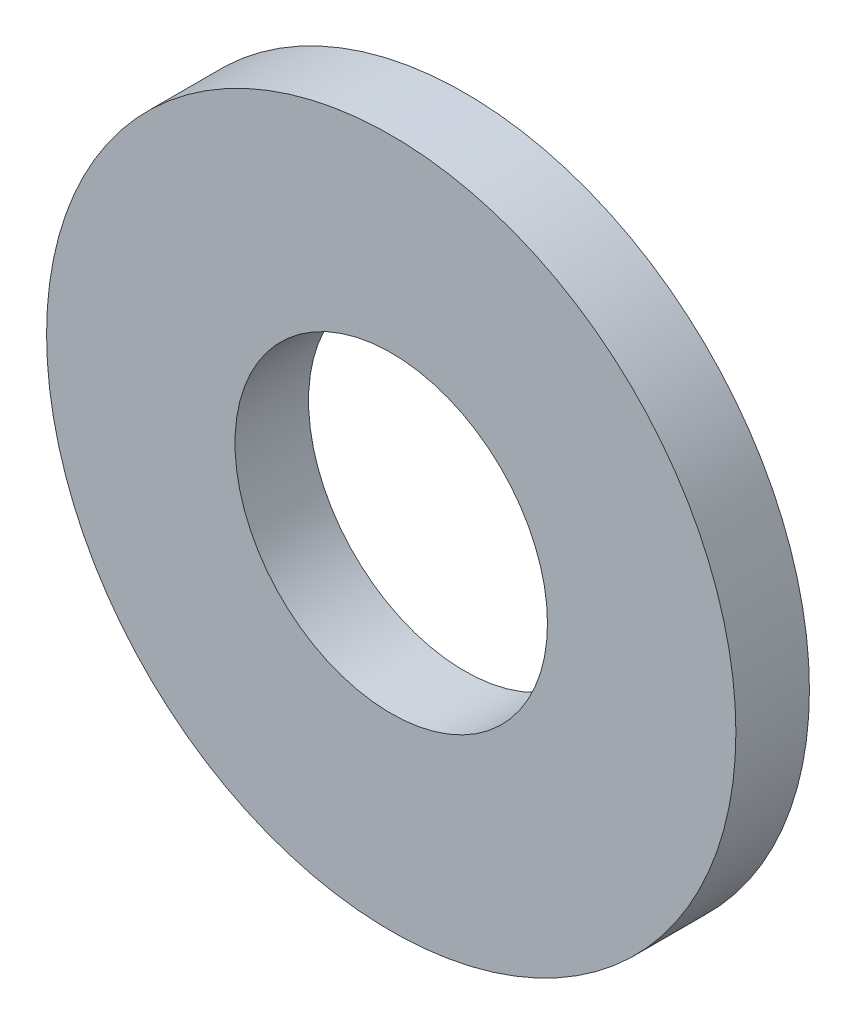
ISO-10303-21;
HEADER;
FILE_DESCRIPTION(('STEP AP214'),'2;1');
FILE_NAME('part.step','',(''),(''),'','','');
FILE_SCHEMA(('AUTOMOTIVE_DESIGN { 1 0 10303 214 1 1 1 1 }'));
ENDSEC;
DATA;
#1=APPLICATION_CONTEXT('core data for automotive mechanical design processes');
#2=APPLICATION_PROTOCOL_DEFINITION('international standard','automotive_design',2000,#1);
#3=PRODUCT_CONTEXT('',#1,'mechanical');
#4=PRODUCT('Part','Part','',(#3));
#5=PRODUCT_RELATED_PRODUCT_CATEGORY('part','',(#4));
#6=PRODUCT_DEFINITION_FORMATION('','',#4);
#7=PRODUCT_DEFINITION_CONTEXT('part definition',#1,'design');
#8=PRODUCT_DEFINITION('design','',#6,#7);
#9=PRODUCT_DEFINITION_SHAPE('','',#8);
#10=(LENGTH_UNIT() NAMED_UNIT(*) SI_UNIT(.MILLI.,.METRE.));
#11=(NAMED_UNIT(*) PLANE_ANGLE_UNIT() SI_UNIT($,.RADIAN.));
#12=(NAMED_UNIT(*) SI_UNIT($,.STERADIAN.) SOLID_ANGLE_UNIT());
#13=UNCERTAINTY_MEASURE_WITH_UNIT(LENGTH_MEASURE(1.E-05),#10,'distance_accuracy_value','');
#14=(GEOMETRIC_REPRESENTATION_CONTEXT(3) GLOBAL_UNCERTAINTY_ASSIGNED_CONTEXT((#13)) GLOBAL_UNIT_ASSIGNED_CONTEXT((#10,
#11,#12)) REPRESENTATION_CONTEXT('',''));
#15=CARTESIAN_POINT('',(0.,0.,0.));
#16=DIRECTION('',(0.,0.,1.));
#17=DIRECTION('',(1.,0.,0.));
#18=AXIS2_PLACEMENT_3D('',#15,#16,#17);
#19=CARTESIAN_POINT('',(0.,0.,0.));
#20=DIRECTION('',(0.,0.,1.));
#21=DIRECTION('',(1.,0.,0.));
#22=AXIS2_PLACEMENT_3D('',#19,#20,#21);
#23=PLANE('',#22);
#24=CARTESIAN_POINT('',(0.,0.,0.));
#25=DIRECTION('',(0.,0.,1.));
#26=DIRECTION('',(1.,0.,0.));
#27=AXIS2_PLACEMENT_3D('',#24,#25,#26);
#28=CIRCLE('',#27,2.159);
#29=CARTESIAN_POINT('',(2.159,0.,0.));
#30=VERTEX_POINT('',#29);
#31=EDGE_CURVE('E27',#30,#30,#28,.T.);
#32=ORIENTED_EDGE('',*,*,#31,.T.);
#33=EDGE_LOOP('',(#32));
#34=FACE_BOUND('',#33,.T.);
#35=CARTESIAN_POINT('',(0.,0.,0.));
#36=DIRECTION('',(0.,0.,1.));
#37=DIRECTION('',(1.,0.,0.));
#38=AXIS2_PLACEMENT_3D('',#35,#36,#37);
#39=CIRCLE('',#38,4.7625);
#40=CARTESIAN_POINT('',(4.7625,0.,0.));
#41=VERTEX_POINT('',#40);
#42=EDGE_CURVE('E18',#41,#41,#39,.T.);
#43=ORIENTED_EDGE('',*,*,#42,.F.);
#44=EDGE_LOOP('',(#43));
#45=FACE_BOUND('',#44,.T.);
#46=ADVANCED_FACE('F15',(#34,#45),#23,.F.);
#47=CARTESIAN_POINT('',(0.,0.,0.));
#48=DIRECTION('',(0.,0.,1.));
#49=DIRECTION('',(1.,0.,0.));
#50=AXIS2_PLACEMENT_3D('',#47,#48,#49);
#51=CYLINDRICAL_SURFACE('',#50,4.7625);
#52=ORIENTED_EDGE('',*,*,#42,.T.);
#53=EDGE_LOOP('',(#52));
#54=FACE_BOUND('',#53,.T.);
#55=CARTESIAN_POINT('',(0.,0.,1.016));
#56=DIRECTION('',(0.,0.,1.));
#57=DIRECTION('',(1.,0.,0.));
#58=AXIS2_PLACEMENT_3D('',#55,#56,#57);
#59=CIRCLE('',#58,4.7625);
#60=CARTESIAN_POINT('',(4.7625,0.,1.016));
#61=VERTEX_POINT('',#60);
#62=EDGE_CURVE('E22',#61,#61,#59,.T.);
#63=ORIENTED_EDGE('',*,*,#62,.F.);
#64=EDGE_LOOP('',(#63));
#65=FACE_BOUND('',#64,.T.);
#66=ADVANCED_FACE('F35',(#54,#65),#51,.T.);
#67=CARTESIAN_POINT('',(0.,0.,0.));
#68=DIRECTION('',(0.,0.,1.));
#69=DIRECTION('',(1.,0.,0.));
#70=AXIS2_PLACEMENT_3D('',#67,#68,#69);
#71=CYLINDRICAL_SURFACE('',#70,2.159);
#72=ORIENTED_EDGE('',*,*,#31,.F.);
#73=EDGE_LOOP('',(#72));
#74=FACE_BOUND('',#73,.T.);
#75=CARTESIAN_POINT('',(0.,0.,1.016));
#76=DIRECTION('',(0.,0.,1.));
#77=DIRECTION('',(1.,0.,0.));
#78=AXIS2_PLACEMENT_3D('',#75,#76,#77);
#79=CIRCLE('',#78,2.159);
#80=CARTESIAN_POINT('',(2.159,0.,1.016));
#81=VERTEX_POINT('',#80);
#82=EDGE_CURVE('E10',#81,#81,#79,.F.);
#83=ORIENTED_EDGE('',*,*,#82,.F.);
#84=EDGE_LOOP('',(#83));
#85=FACE_BOUND('',#84,.T.);
#86=ADVANCED_FACE('F43',(#74,#85),#71,.F.);
#87=CARTESIAN_POINT('',(0.,0.,1.016));
#88=DIRECTION('',(0.,0.,1.));
#89=DIRECTION('',(1.,0.,0.));
#90=AXIS2_PLACEMENT_3D('',#87,#88,#89);
#91=PLANE('',#90);
#92=ORIENTED_EDGE('',*,*,#82,.T.);
#93=EDGE_LOOP('',(#92));
#94=FACE_BOUND('',#93,.T.);
#95=ORIENTED_EDGE('',*,*,#62,.T.);
#96=EDGE_LOOP('',(#95));
#97=FACE_BOUND('',#96,.T.);
#98=ADVANCED_FACE('F44',(#94,#97),#91,.T.);
#99=CLOSED_SHELL('',(#46,#66,#86,#98));
#100=MANIFOLD_SOLID_BREP('B1',#99);
#101=ADVANCED_BREP_SHAPE_REPRESENTATION('',(#18,#100),#14);
#102=SHAPE_DEFINITION_REPRESENTATION(#9,#101);
ENDSEC;
END-ISO-10303-21;
